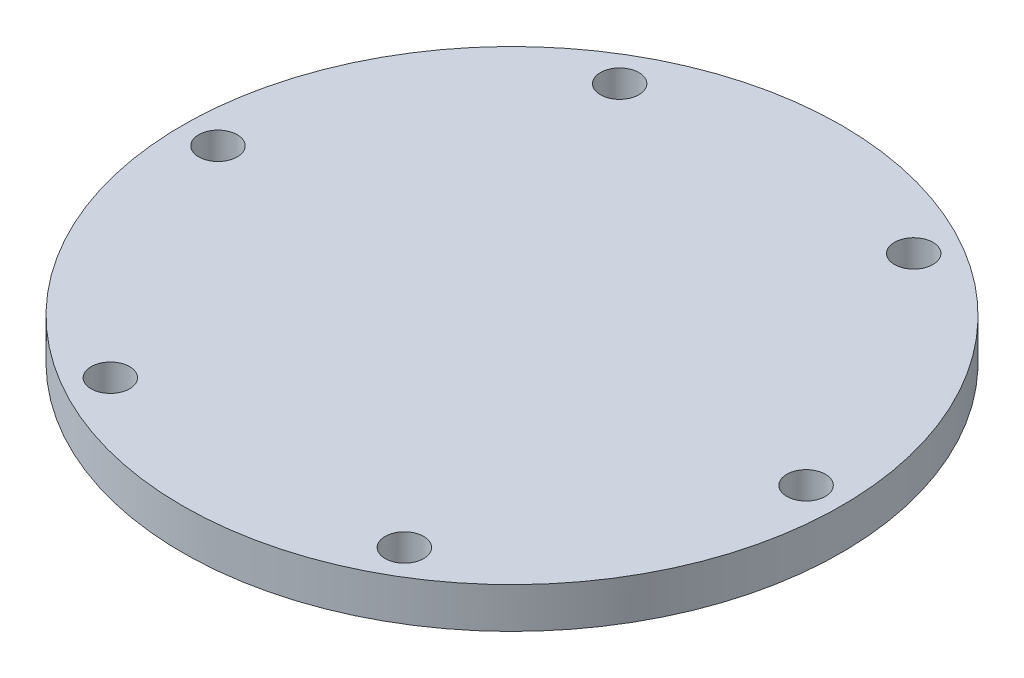
ISO-10303-21;
HEADER;
FILE_DESCRIPTION(('STEP AP214'),'2;1');
FILE_NAME('part.step','',(''),(''),'','','');
FILE_SCHEMA(('AUTOMOTIVE_DESIGN { 1 0 10303 214 1 1 1 1 }'));
ENDSEC;
DATA;
#1=APPLICATION_CONTEXT('core data for automotive mechanical design processes');
#2=APPLICATION_PROTOCOL_DEFINITION('international standard','automotive_design',2000,#1);
#3=PRODUCT_CONTEXT('',#1,'mechanical');
#4=PRODUCT('Part','Part','',(#3));
#5=PRODUCT_RELATED_PRODUCT_CATEGORY('part','',(#4));
#6=PRODUCT_DEFINITION_FORMATION('','',#4);
#7=PRODUCT_DEFINITION_CONTEXT('part definition',#1,'design');
#8=PRODUCT_DEFINITION('design','',#6,#7);
#9=PRODUCT_DEFINITION_SHAPE('','',#8);
#10=(LENGTH_UNIT() NAMED_UNIT(*) SI_UNIT(.MILLI.,.METRE.));
#11=(NAMED_UNIT(*) PLANE_ANGLE_UNIT() SI_UNIT($,.RADIAN.));
#12=(NAMED_UNIT(*) SI_UNIT($,.STERADIAN.) SOLID_ANGLE_UNIT());
#13=UNCERTAINTY_MEASURE_WITH_UNIT(LENGTH_MEASURE(1.E-05),#10,'distance_accuracy_value','');
#14=(GEOMETRIC_REPRESENTATION_CONTEXT(3) GLOBAL_UNCERTAINTY_ASSIGNED_CONTEXT((#13)) GLOBAL_UNIT_ASSIGNED_CONTEXT((#10,
#11,#12)) REPRESENTATION_CONTEXT('',''));
#15=CARTESIAN_POINT('',(0.,0.,0.));
#16=DIRECTION('',(0.,0.,1.));
#17=DIRECTION('',(1.,0.,0.));
#18=AXIS2_PLACEMENT_3D('',#15,#16,#17);
#19=CARTESIAN_POINT('',(0.,7.62,0.));
#20=DIRECTION('',(0.,-1.,0.));
#21=DIRECTION('',(0.,0.,-1.));
#22=AXIS2_PLACEMENT_3D('',#19,#20,#21);
#23=CYLINDRICAL_SURFACE('',#22,13.97);
#24=CARTESIAN_POINT('',(0.,7.62,0.));
#25=DIRECTION('',(0.,-1.,0.));
#26=DIRECTION('',(0.,0.,-1.));
#27=AXIS2_PLACEMENT_3D('',#24,#25,#26);
#28=CIRCLE('',#27,13.97);
#29=CARTESIAN_POINT('',(0.,7.62,-13.97));
#30=VERTEX_POINT('',#29);
#31=EDGE_CURVE('E123',#30,#30,#28,.T.);
#32=CARTESIAN_POINT('',(0.,6.35,0.));
#33=DIRECTION('',(0.,1.,0.));
#34=DIRECTION('',(0.,0.,1.));
#35=AXIS2_PLACEMENT_3D('',#32,#33,#34);
#36=CIRCLE('',#35,13.97);
#37=CARTESIAN_POINT('',(0.,6.35,-13.97));
#38=VERTEX_POINT('',#37);
#39=EDGE_CURVE('E137',#38,#38,#36,.T.);
#40=CARTESIAN_POINT('',(0.,7.62,-13.97));
#41=CARTESIAN_POINT('',(0.,7.60677083333333,-13.97));
#42=CARTESIAN_POINT('',(0.,7.59354166666667,-13.97));
#43=CARTESIAN_POINT('',(0.,7.56708333333333,-13.97));
#44=CARTESIAN_POINT('',(0.,7.55385416666667,-13.97));
#45=CARTESIAN_POINT('',(0.,7.52739583333333,-13.97));
#46=CARTESIAN_POINT('',(0.,7.51416666666667,-13.97));
#47=CARTESIAN_POINT('',(0.,7.48770833333333,-13.97));
#48=CARTESIAN_POINT('',(0.,7.47447916666667,-13.97));
#49=CARTESIAN_POINT('',(0.,7.44802083333333,-13.97));
#50=CARTESIAN_POINT('',(0.,7.43479166666667,-13.97));
#51=CARTESIAN_POINT('',(0.,7.40833333333333,-13.97));
#52=CARTESIAN_POINT('',(0.,7.39510416666667,-13.97));
#53=CARTESIAN_POINT('',(0.,7.36864583333333,-13.97));
#54=CARTESIAN_POINT('',(0.,7.35541666666667,-13.97));
#55=CARTESIAN_POINT('',(0.,7.32895833333333,-13.97));
#56=CARTESIAN_POINT('',(0.,7.31572916666667,-13.97));
#57=CARTESIAN_POINT('',(0.,7.28927083333333,-13.97));
#58=CARTESIAN_POINT('',(0.,7.27604166666667,-13.97));
#59=CARTESIAN_POINT('',(0.,7.24958333333333,-13.97));
#60=CARTESIAN_POINT('',(0.,7.23635416666666,-13.97));
#61=CARTESIAN_POINT('',(0.,7.20989583333333,-13.97));
#62=CARTESIAN_POINT('',(0.,7.19666666666667,-13.97));
#63=CARTESIAN_POINT('',(0.,7.17020833333333,-13.97));
#64=CARTESIAN_POINT('',(0.,7.15697916666667,-13.97));
#65=CARTESIAN_POINT('',(0.,7.13052083333333,-13.97));
#66=CARTESIAN_POINT('',(0.,7.11729166666666,-13.97));
#67=CARTESIAN_POINT('',(0.,7.09083333333333,-13.97));
#68=CARTESIAN_POINT('',(0.,7.07760416666667,-13.97));
#69=CARTESIAN_POINT('',(0.,7.05114583333333,-13.97));
#70=CARTESIAN_POINT('',(0.,7.03791666666667,-13.97));
#71=CARTESIAN_POINT('',(0.,7.01145833333333,-13.97));
#72=CARTESIAN_POINT('',(0.,6.99822916666666,-13.97));
#73=CARTESIAN_POINT('',(0.,6.97177083333333,-13.97));
#74=CARTESIAN_POINT('',(0.,6.95854166666667,-13.97));
#75=CARTESIAN_POINT('',(0.,6.93208333333333,-13.97));
#76=CARTESIAN_POINT('',(0.,6.91885416666666,-13.97));
#77=CARTESIAN_POINT('',(0.,6.89239583333333,-13.97));
#78=CARTESIAN_POINT('',(0.,6.87916666666666,-13.97));
#79=CARTESIAN_POINT('',(0.,6.85270833333333,-13.97));
#80=CARTESIAN_POINT('',(0.,6.83947916666666,-13.97));
#81=CARTESIAN_POINT('',(0.,6.81302083333333,-13.97));
#82=CARTESIAN_POINT('',(0.,6.79979166666666,-13.97));
#83=CARTESIAN_POINT('',(0.,6.77333333333333,-13.97));
#84=CARTESIAN_POINT('',(0.,6.76010416666666,-13.97));
#85=CARTESIAN_POINT('',(0.,6.73364583333333,-13.97));
#86=CARTESIAN_POINT('',(0.,6.72041666666666,-13.97));
#87=CARTESIAN_POINT('',(0.,6.69395833333333,-13.97));
#88=CARTESIAN_POINT('',(0.,6.68072916666666,-13.97));
#89=CARTESIAN_POINT('',(0.,6.65427083333333,-13.97));
#90=CARTESIAN_POINT('',(0.,6.64104166666666,-13.97));
#91=CARTESIAN_POINT('',(0.,6.61458333333333,-13.97));
#92=CARTESIAN_POINT('',(0.,6.60135416666666,-13.97));
#93=CARTESIAN_POINT('',(0.,6.57489583333333,-13.97));
#94=CARTESIAN_POINT('',(0.,6.56166666666666,-13.97));
#95=CARTESIAN_POINT('',(0.,6.53520833333333,-13.97));
#96=CARTESIAN_POINT('',(0.,6.52197916666666,-13.97));
#97=CARTESIAN_POINT('',(0.,6.49552083333333,-13.97));
#98=CARTESIAN_POINT('',(0.,6.48229166666666,-13.97));
#99=CARTESIAN_POINT('',(0.,6.45583333333333,-13.97));
#100=CARTESIAN_POINT('',(0.,6.44260416666666,-13.97));
#101=CARTESIAN_POINT('',(0.,6.41614583333333,-13.97));
#102=CARTESIAN_POINT('',(0.,6.40291666666666,-13.97));
#103=CARTESIAN_POINT('',(0.,6.37645833333333,-13.97));
#104=CARTESIAN_POINT('',(0.,6.36322916666666,-13.97));
#105=CARTESIAN_POINT('',(0.,6.35,-13.97));
#106=B_SPLINE_CURVE_WITH_KNOTS('',3,(#40,#41,#42,#43,#44,#45,#46,#47,#48,#49,#50,#51,#52,#53,
#54,#55,#56,#57,#58,#59,#60,#61,#62,#63,#64,#65,#66,#67,#68,#69,#70,#71,#72,#73,#74,#75,#76,#77,
#78,#79,#80,#81,#82,#83,#84,#85,#86,#87,#88,#89,#90,#91,#92,#93,#94,#95,#96,#97,#98,#99,#100,
#101,#102,#103,#104,#105),.UNSPECIFIED.,.F.,.F.,(4,2,2,2,2,2,2,2,2,2,2,2,2,2,2,2,2,2,2,2,2,2,2,
2,2,2,2,2,2,2,2,2,4),(0.,0.0396874999999998,0.0793749999999996,0.119062499999999,0.15875,
0.1984375,0.238125,0.2778125,0.3175,0.3571875,0.396875000000001,0.4365625,0.47625,
0.515937500000001,0.555625000000001,0.5953125,0.635000000000001,0.674687500000001,
0.714375000000001,0.754062500000001,0.793750000000001,0.833437500000001,0.873125000000001,
0.912812500000001,0.952500000000001,0.992187500000001,1.031875,1.0715625,1.11125,1.1509375,
1.190625,1.2303125,1.27),.UNSPECIFIED.);
#107=EDGE_CURVE('BSEAM50',#30,#38,#106,.T.);
#108=ORIENTED_EDGE('',*,*,#31,.T.);
#109=ORIENTED_EDGE('',*,*,#39,.T.);
#110=ORIENTED_EDGE('',*,*,#107,.T.);
#111=ORIENTED_EDGE('',*,*,#107,.F.);
#112=EDGE_LOOP('',(#108,#110,#109,#111));
#113=FACE_BOUND('',#112,.T.);
#114=ADVANCED_FACE('F50',(#113),#23,.T.);
#115=CARTESIAN_POINT('',(0.,12.7,0.));
#116=DIRECTION('',(0.,-1.,0.));
#117=DIRECTION('',(0.,0.,-1.));
#118=AXIS2_PLACEMENT_3D('',#115,#116,#117);
#119=CYLINDRICAL_SURFACE('',#118,32.385);
#120=CARTESIAN_POINT('',(0.,7.62,0.));
#121=DIRECTION('',(0.,-1.,0.));
#122=DIRECTION('',(0.,0.,-1.));
#123=AXIS2_PLACEMENT_3D('',#120,#121,#122);
#124=CIRCLE('',#123,32.385);
#125=CARTESIAN_POINT('',(0.,7.62,-32.385));
#126=VERTEX_POINT('',#125);
#127=EDGE_CURVE('E118',#126,#126,#124,.T.);
#128=ORIENTED_EDGE('',*,*,#127,.F.);
#129=EDGE_LOOP('',(#128));
#130=FACE_BOUND('',#129,.T.);
#131=CARTESIAN_POINT('',(0.,8.89,0.));
#132=DIRECTION('',(0.,1.,0.));
#133=DIRECTION('',(0.,0.,1.));
#134=AXIS2_PLACEMENT_3D('',#131,#132,#133);
#135=CIRCLE('',#134,32.385);
#136=CARTESIAN_POINT('',(0.,8.89,32.385));
#137=VERTEX_POINT('',#136);
#138=EDGE_CURVE('E125',#137,#137,#135,.T.);
#139=ORIENTED_EDGE('',*,*,#138,.F.);
#140=EDGE_LOOP('',(#139));
#141=FACE_BOUND('',#140,.T.);
#142=ADVANCED_FACE('F77',(#130,#141),#119,.T.);
#143=CARTESIAN_POINT('',(0.,7.62,0.));
#144=DIRECTION('',(0.,-1.,0.));
#145=DIRECTION('',(0.,0.,-1.));
#146=AXIS2_PLACEMENT_3D('',#143,#144,#145);
#147=PLANE('',#146);
#148=ORIENTED_EDGE('',*,*,#31,.F.);
#149=EDGE_LOOP('',(#148));
#150=FACE_BOUND('',#149,.T.);
#151=ORIENTED_EDGE('',*,*,#127,.T.);
#152=EDGE_LOOP('',(#151));
#153=FACE_BOUND('',#152,.T.);
#154=ADVANCED_FACE('F82',(#150,#153),#147,.T.);
#155=CARTESIAN_POINT('',(32.385,8.89,0.));
#156=DIRECTION('',(0.,1.,0.));
#157=DIRECTION('',(0.,0.,1.));
#158=AXIS2_PLACEMENT_3D('',#155,#156,#157);
#159=PLANE('',#158);
#160=ORIENTED_EDGE('',*,*,#138,.T.);
#161=EDGE_LOOP('',(#160));
#162=FACE_BOUND('',#161,.T.);
#163=CARTESIAN_POINT('',(0.,8.89,0.));
#164=DIRECTION('',(0.,1.,0.));
#165=DIRECTION('',(0.,0.,1.));
#166=AXIS2_PLACEMENT_3D('',#163,#164,#165);
#167=CIRCLE('',#166,30.099);
#168=CARTESIAN_POINT('',(0.,8.89,30.099));
#169=VERTEX_POINT('',#168);
#170=EDGE_CURVE('E128',#169,#169,#167,.T.);
#171=ORIENTED_EDGE('',*,*,#170,.F.);
#172=EDGE_LOOP('',(#171));
#173=FACE_BOUND('',#172,.T.);
#174=ADVANCED_FACE('F90',(#162,#173),#159,.T.);
#175=CARTESIAN_POINT('',(0.,18.669,0.));
#176=DIRECTION('',(0.,1.,0.));
#177=DIRECTION('',(0.,0.,1.));
#178=AXIS2_PLACEMENT_3D('',#175,#176,#177);
#179=CYLINDRICAL_SURFACE('',#178,30.099);
#180=ORIENTED_EDGE('',*,*,#170,.T.);
#181=EDGE_LOOP('',(#180));
#182=FACE_BOUND('',#181,.T.);
#183=CARTESIAN_POINT('',(0.,11.43,0.));
#184=DIRECTION('',(0.,1.,0.));
#185=DIRECTION('',(0.,0.,1.));
#186=AXIS2_PLACEMENT_3D('',#183,#184,#185);
#187=CIRCLE('',#186,30.099);
#188=CARTESIAN_POINT('',(0.,11.43,30.099));
#189=VERTEX_POINT('',#188);
#190=EDGE_CURVE('E131',#189,#189,#187,.T.);
#191=ORIENTED_EDGE('',*,*,#190,.F.);
#192=EDGE_LOOP('',(#191));
#193=FACE_BOUND('',#192,.T.);
#194=ADVANCED_FACE('F221',(#182,#193),#179,.T.);
#195=CARTESIAN_POINT('',(30.099,11.43,0.));
#196=DIRECTION('',(0.,-1.,0.));
#197=DIRECTION('',(0.,0.,-1.));
#198=AXIS2_PLACEMENT_3D('',#195,#196,#197);
#199=PLANE('',#198);
#200=ORIENTED_EDGE('',*,*,#190,.T.);
#201=EDGE_LOOP('',(#200));
#202=FACE_BOUND('',#201,.T.);
#203=CARTESIAN_POINT('',(0.,11.43,0.));
#204=DIRECTION('',(0.,1.,0.));
#205=DIRECTION('',(0.,0.,1.));
#206=AXIS2_PLACEMENT_3D('',#203,#204,#205);
#207=CIRCLE('',#206,32.385);
#208=CARTESIAN_POINT('',(0.,11.43,32.385));
#209=VERTEX_POINT('',#208);
#210=EDGE_CURVE('E134',#209,#209,#207,.T.);
#211=ORIENTED_EDGE('',*,*,#210,.F.);
#212=EDGE_LOOP('',(#211));
#213=FACE_BOUND('',#212,.T.);
#214=ADVANCED_FACE('F102',(#202,#213),#199,.T.);
#215=CARTESIAN_POINT('',(0.,17.78,0.));
#216=DIRECTION('',(0.,1.,0.));
#217=DIRECTION('',(0.,0.,1.));
#218=AXIS2_PLACEMENT_3D('',#215,#216,#217);
#219=PLANE('',#218);
#220=CARTESIAN_POINT('',(-18.4150000000004,17.78,31.8957156213807));
#221=DIRECTION('',(0.,1.,0.));
#222=DIRECTION('',(0.866025403784433,0.,0.50000000000001));
#223=AXIS2_PLACEMENT_3D('',#220,#221,#222);
#224=CIRCLE('',#223,2.413);
#225=CARTESIAN_POINT('',(-16.3252807006685,17.78,33.1022156213807));
#226=VERTEX_POINT('',#225);
#227=EDGE_CURVE('E165',#226,#226,#224,.T.);
#228=ORIENTED_EDGE('',*,*,#227,.F.);
#229=EDGE_LOOP('',(#228));
#230=FACE_BOUND('',#229,.T.);
#231=CARTESIAN_POINT('',(18.4149999999997,17.78,31.895715621381));
#232=DIRECTION('',(0.,1.,0.));
#233=DIRECTION('',(0.866025403784443,0.,-0.499999999999992));
#234=AXIS2_PLACEMENT_3D('',#231,#232,#233);
#235=CIRCLE('',#234,2.413);
#236=CARTESIAN_POINT('',(20.5047192993316,17.78,30.6892156213811));
#237=VERTEX_POINT('',#236);
#238=EDGE_CURVE('E171',#237,#237,#235,.T.);
#239=ORIENTED_EDGE('',*,*,#238,.F.);
#240=EDGE_LOOP('',(#239));
#241=FACE_BOUND('',#240,.T.);
#242=CARTESIAN_POINT('',(36.83,17.78,0.));
#243=DIRECTION('',(0.,1.,0.));
#244=DIRECTION('',(0.,0.,-1.));
#245=AXIS2_PLACEMENT_3D('',#242,#243,#244);
#246=CIRCLE('',#245,2.413);
#247=CARTESIAN_POINT('',(36.83,17.78,-2.413));
#248=VERTEX_POINT('',#247);
#249=EDGE_CURVE('E177',#248,#248,#246,.T.);
#250=ORIENTED_EDGE('',*,*,#249,.F.);
#251=EDGE_LOOP('',(#250));
#252=FACE_BOUND('',#251,.T.);
#253=CARTESIAN_POINT('',(18.4150000000001,17.78,-31.8957156213808));
#254=DIRECTION('',(0.,1.,0.));
#255=DIRECTION('',(-0.866025403784436,0.,-0.500000000000004));
#256=AXIS2_PLACEMENT_3D('',#253,#254,#255);
#257=CIRCLE('',#256,2.413);
#258=CARTESIAN_POINT('',(16.3252807006683,17.78,-33.1022156213808));
#259=VERTEX_POINT('',#258);
#260=EDGE_CURVE('E159',#259,#259,#257,.T.);
#261=ORIENTED_EDGE('',*,*,#260,.F.);
#262=EDGE_LOOP('',(#261));
#263=FACE_BOUND('',#262,.T.);
#264=CARTESIAN_POINT('',(-18.4149999999999,17.78,-31.8957156213809));
#265=DIRECTION('',(0.,1.,0.));
#266=DIRECTION('',(-0.86602540378444,0.,0.499999999999998));
#267=AXIS2_PLACEMENT_3D('',#264,#265,#266);
#268=CIRCLE('',#267,2.413);
#269=CARTESIAN_POINT('',(-20.5047192993318,17.78,-30.6892156213809));
#270=VERTEX_POINT('',#269);
#271=EDGE_CURVE('E153',#270,#270,#268,.T.);
#272=ORIENTED_EDGE('',*,*,#271,.F.);
#273=EDGE_LOOP('',(#272));
#274=FACE_BOUND('',#273,.T.);
#275=CARTESIAN_POINT('',(-36.83,17.78,0.));
#276=DIRECTION('',(0.,1.,0.));
#277=DIRECTION('',(0.,0.,1.));
#278=AXIS2_PLACEMENT_3D('',#275,#276,#277);
#279=CIRCLE('',#278,2.413);
#280=CARTESIAN_POINT('',(-36.83,17.78,2.413));
#281=VERTEX_POINT('',#280);
#282=EDGE_CURVE('E149',#281,#281,#279,.T.);
#283=ORIENTED_EDGE('',*,*,#282,.F.);
#284=EDGE_LOOP('',(#283));
#285=FACE_BOUND('',#284,.T.);
#286=CARTESIAN_POINT('',(0.,17.78,0.));
#287=DIRECTION('',(0.,1.,0.));
#288=DIRECTION('',(0.,0.,1.));
#289=AXIS2_PLACEMENT_3D('',#286,#287,#288);
#290=CIRCLE('',#289,41.275);
#291=CARTESIAN_POINT('',(0.,17.78,41.275));
#292=VERTEX_POINT('',#291);
#293=EDGE_CURVE('E58',#292,#292,#290,.T.);
#294=ORIENTED_EDGE('',*,*,#293,.T.);
#295=EDGE_LOOP('',(#294));
#296=FACE_BOUND('',#295,.T.);
#297=ADVANCED_FACE('F100',(#230,#241,#252,#263,#274,#285,#296),#219,.T.);
#298=CARTESIAN_POINT('',(0.,17.78,0.));
#299=DIRECTION('',(0.,-1.,0.));
#300=DIRECTION('',(0.,0.,-1.));
#301=AXIS2_PLACEMENT_3D('',#298,#299,#300);
#302=CYLINDRICAL_SURFACE('',#301,41.275);
#303=ORIENTED_EDGE('',*,*,#293,.F.);
#304=EDGE_LOOP('',(#303));
#305=FACE_BOUND('',#304,.T.);
#306=CARTESIAN_POINT('',(0.,12.7,0.));
#307=DIRECTION('',(0.,-1.,0.));
#308=DIRECTION('',(0.,0.,-1.));
#309=AXIS2_PLACEMENT_3D('',#306,#307,#308);
#310=CIRCLE('',#309,41.275);
#311=CARTESIAN_POINT('',(0.,12.7,-41.275));
#312=VERTEX_POINT('',#311);
#313=EDGE_CURVE('E113',#312,#312,#310,.T.);
#314=ORIENTED_EDGE('',*,*,#313,.F.);
#315=EDGE_LOOP('',(#314));
#316=FACE_BOUND('',#315,.T.);
#317=ADVANCED_FACE('F98',(#305,#316),#302,.T.);
#318=CARTESIAN_POINT('',(0.,12.7,0.));
#319=DIRECTION('',(0.,-1.,0.));
#320=DIRECTION('',(0.,0.,-1.));
#321=AXIS2_PLACEMENT_3D('',#318,#319,#320);
#322=PLANE('',#321);
#323=CARTESIAN_POINT('',(-18.4150000000004,12.7,31.8957156213807));
#324=DIRECTION('',(0.,-1.,0.));
#325=DIRECTION('',(0.,0.,-1.));
#326=AXIS2_PLACEMENT_3D('',#323,#324,#325);
#327=CIRCLE('',#326,2.413);
#328=CARTESIAN_POINT('',(-18.4150000000004,12.7,29.4827156213807));
#329=VERTEX_POINT('',#328);
#330=EDGE_CURVE('E162',#329,#329,#327,.F.);
#331=ORIENTED_EDGE('',*,*,#330,.T.);
#332=EDGE_LOOP('',(#331));
#333=FACE_BOUND('',#332,.T.);
#334=CARTESIAN_POINT('',(18.4149999999997,12.7,31.895715621381));
#335=DIRECTION('',(0.,-1.,0.));
#336=DIRECTION('',(0.,0.,-1.));
#337=AXIS2_PLACEMENT_3D('',#334,#335,#336);
#338=CIRCLE('',#337,2.413);
#339=CARTESIAN_POINT('',(18.4149999999997,12.7,29.482715621381));
#340=VERTEX_POINT('',#339);
#341=EDGE_CURVE('E168',#340,#340,#338,.F.);
#342=ORIENTED_EDGE('',*,*,#341,.T.);
#343=EDGE_LOOP('',(#342));
#344=FACE_BOUND('',#343,.T.);
#345=CARTESIAN_POINT('',(36.83,12.7,0.));
#346=DIRECTION('',(0.,-1.,0.));
#347=DIRECTION('',(0.,0.,-1.));
#348=AXIS2_PLACEMENT_3D('',#345,#346,#347);
#349=CIRCLE('',#348,2.413);
#350=CARTESIAN_POINT('',(36.83,12.7,-2.413));
#351=VERTEX_POINT('',#350);
#352=EDGE_CURVE('E174',#351,#351,#349,.F.);
#353=ORIENTED_EDGE('',*,*,#352,.T.);
#354=EDGE_LOOP('',(#353));
#355=FACE_BOUND('',#354,.T.);
#356=CARTESIAN_POINT('',(18.4150000000001,12.7,-31.8957156213808));
#357=DIRECTION('',(0.,-1.,0.));
#358=DIRECTION('',(0.,0.,-1.));
#359=AXIS2_PLACEMENT_3D('',#356,#357,#358);
#360=CIRCLE('',#359,2.413);
#361=CARTESIAN_POINT('',(18.4150000000001,12.7,-34.3087156213808));
#362=VERTEX_POINT('',#361);
#363=EDGE_CURVE('E180',#362,#362,#360,.F.);
#364=ORIENTED_EDGE('',*,*,#363,.T.);
#365=EDGE_LOOP('',(#364));
#366=FACE_BOUND('',#365,.T.);
#367=CARTESIAN_POINT('',(-18.4149999999999,12.7,-31.8957156213809));
#368=DIRECTION('',(0.,-1.,0.));
#369=DIRECTION('',(0.,0.,-1.));
#370=AXIS2_PLACEMENT_3D('',#367,#368,#369);
#371=CIRCLE('',#370,2.413);
#372=CARTESIAN_POINT('',(-18.4149999999999,12.7,-34.3087156213809));
#373=VERTEX_POINT('',#372);
#374=EDGE_CURVE('E156',#373,#373,#371,.F.);
#375=ORIENTED_EDGE('',*,*,#374,.T.);
#376=EDGE_LOOP('',(#375));
#377=FACE_BOUND('',#376,.T.);
#378=CARTESIAN_POINT('',(-36.83,12.7,0.));
#379=DIRECTION('',(0.,-1.,0.));
#380=DIRECTION('',(0.,0.,-1.));
#381=AXIS2_PLACEMENT_3D('',#378,#379,#380);
#382=CIRCLE('',#381,2.413);
#383=CARTESIAN_POINT('',(-36.83,12.7,-2.413));
#384=VERTEX_POINT('',#383);
#385=EDGE_CURVE('E150',#384,#384,#382,.F.);
#386=ORIENTED_EDGE('',*,*,#385,.T.);
#387=EDGE_LOOP('',(#386));
#388=FACE_BOUND('',#387,.T.);
#389=CARTESIAN_POINT('',(0.,12.7,0.));
#390=DIRECTION('',(0.,-1.,0.));
#391=DIRECTION('',(0.,0.,-1.));
#392=AXIS2_PLACEMENT_3D('',#389,#390,#391);
#393=CIRCLE('',#392,32.385);
#394=CARTESIAN_POINT('',(0.,12.7,-32.385));
#395=VERTEX_POINT('',#394);
#396=EDGE_CURVE('E115',#395,#395,#393,.T.);
#397=ORIENTED_EDGE('',*,*,#396,.F.);
#398=EDGE_LOOP('',(#397));
#399=FACE_BOUND('',#398,.T.);
#400=ORIENTED_EDGE('',*,*,#313,.T.);
#401=EDGE_LOOP('',(#400));
#402=FACE_BOUND('',#401,.T.);
#403=ADVANCED_FACE('F95',(#333,#344,#355,#366,#377,#388,#399,#402),#322,.T.);
#404=ORIENTED_EDGE('',*,*,#396,.T.);
#405=EDGE_LOOP('',(#404));
#406=FACE_BOUND('',#405,.T.);
#407=ORIENTED_EDGE('',*,*,#210,.T.);
#408=EDGE_LOOP('',(#407));
#409=FACE_BOUND('',#408,.T.);
#410=ADVANCED_FACE('F85',(#406,#409),#119,.T.);
#411=CARTESIAN_POINT('',(13.97,6.35,0.));
#412=DIRECTION('',(0.,-1.,0.));
#413=DIRECTION('',(0.,0.,-1.));
#414=AXIS2_PLACEMENT_3D('',#411,#412,#413);
#415=PLANE('',#414);
#416=CARTESIAN_POINT('',(0.,6.35,0.));
#417=DIRECTION('',(0.,1.,0.));
#418=DIRECTION('',(0.,0.,1.));
#419=AXIS2_PLACEMENT_3D('',#416,#417,#418);
#420=CIRCLE('',#419,11.684);
#421=CARTESIAN_POINT('',(0.,6.35,11.684));
#422=VERTEX_POINT('',#421);
#423=EDGE_CURVE('E140',#422,#422,#420,.T.);
#424=ORIENTED_EDGE('',*,*,#423,.T.);
#425=EDGE_LOOP('',(#424));
#426=FACE_BOUND('',#425,.T.);
#427=ORIENTED_EDGE('',*,*,#39,.F.);
#428=EDGE_LOOP('',(#427));
#429=FACE_BOUND('',#428,.T.);
#430=ADVANCED_FACE('F215',(#426,#429),#415,.T.);
#431=CARTESIAN_POINT('',(0.,18.669,0.));
#432=DIRECTION('',(0.,1.,0.));
#433=DIRECTION('',(0.,0.,1.));
#434=AXIS2_PLACEMENT_3D('',#431,#432,#433);
#435=CYLINDRICAL_SURFACE('',#434,11.684);
#436=CARTESIAN_POINT('',(0.,3.81,0.));
#437=DIRECTION('',(0.,1.,0.));
#438=DIRECTION('',(0.,0.,1.));
#439=AXIS2_PLACEMENT_3D('',#436,#437,#438);
#440=CIRCLE('',#439,11.684);
#441=CARTESIAN_POINT('',(0.,3.81,11.684));
#442=VERTEX_POINT('',#441);
#443=EDGE_CURVE('E143',#442,#442,#440,.T.);
#444=ORIENTED_EDGE('',*,*,#443,.T.);
#445=EDGE_LOOP('',(#444));
#446=FACE_BOUND('',#445,.T.);
#447=ORIENTED_EDGE('',*,*,#423,.F.);
#448=EDGE_LOOP('',(#447));
#449=FACE_BOUND('',#448,.T.);
#450=ADVANCED_FACE('F211',(#446,#449),#435,.T.);
#451=CARTESIAN_POINT('',(11.684,3.81,0.));
#452=DIRECTION('',(0.,1.,0.));
#453=DIRECTION('',(0.,0.,1.));
#454=AXIS2_PLACEMENT_3D('',#451,#452,#453);
#455=PLANE('',#454);
#456=CARTESIAN_POINT('',(0.,3.81,0.));
#457=DIRECTION('',(0.,1.,0.));
#458=DIRECTION('',(0.,0.,1.));
#459=AXIS2_PLACEMENT_3D('',#456,#457,#458);
#460=CIRCLE('',#459,13.97);
#461=CARTESIAN_POINT('',(0.,3.81,-13.97));
#462=VERTEX_POINT('',#461);
#463=EDGE_CURVE('E146',#462,#462,#460,.T.);
#464=ORIENTED_EDGE('',*,*,#463,.T.);
#465=EDGE_LOOP('',(#464));
#466=FACE_BOUND('',#465,.T.);
#467=ORIENTED_EDGE('',*,*,#443,.F.);
#468=EDGE_LOOP('',(#467));
#469=FACE_BOUND('',#468,.T.);
#470=ADVANCED_FACE('F72',(#466,#469),#455,.T.);
#471=CARTESIAN_POINT('',(0.,2.54,0.));
#472=DIRECTION('',(0.,1.,0.));
#473=DIRECTION('',(0.,0.,1.));
#474=AXIS2_PLACEMENT_3D('',#471,#472,#473);
#475=CIRCLE('',#474,13.97);
#476=CARTESIAN_POINT('',(0.,2.54,-13.97));
#477=VERTEX_POINT('',#476);
#478=EDGE_CURVE('E13',#477,#477,#475,.T.);
#479=CARTESIAN_POINT('',(0.,2.54,-13.97));
#480=CARTESIAN_POINT('',(0.,2.55322916666667,-13.97));
#481=CARTESIAN_POINT('',(0.,2.56645833333333,-13.97));
#482=CARTESIAN_POINT('',(0.,2.59291666666667,-13.97));
#483=CARTESIAN_POINT('',(0.,2.60614583333333,-13.97));
#484=CARTESIAN_POINT('',(0.,2.63260416666667,-13.97));
#485=CARTESIAN_POINT('',(0.,2.64583333333333,-13.97));
#486=CARTESIAN_POINT('',(0.,2.67229166666667,-13.97));
#487=CARTESIAN_POINT('',(0.,2.68552083333333,-13.97));
#488=CARTESIAN_POINT('',(0.,2.71197916666667,-13.97));
#489=CARTESIAN_POINT('',(0.,2.72520833333333,-13.97));
#490=CARTESIAN_POINT('',(0.,2.75166666666667,-13.97));
#491=CARTESIAN_POINT('',(0.,2.76489583333333,-13.97));
#492=CARTESIAN_POINT('',(0.,2.79135416666667,-13.97));
#493=CARTESIAN_POINT('',(0.,2.80458333333333,-13.97));
#494=CARTESIAN_POINT('',(0.,2.83104166666667,-13.97));
#495=CARTESIAN_POINT('',(0.,2.84427083333333,-13.97));
#496=CARTESIAN_POINT('',(0.,2.87072916666667,-13.97));
#497=CARTESIAN_POINT('',(0.,2.88395833333333,-13.97));
#498=CARTESIAN_POINT('',(0.,2.91041666666667,-13.97));
#499=CARTESIAN_POINT('',(0.,2.92364583333333,-13.97));
#500=CARTESIAN_POINT('',(0.,2.95010416666667,-13.97));
#501=CARTESIAN_POINT('',(0.,2.96333333333333,-13.97));
#502=CARTESIAN_POINT('',(0.,2.98979166666667,-13.97));
#503=CARTESIAN_POINT('',(0.,3.00302083333333,-13.97));
#504=CARTESIAN_POINT('',(0.,3.02947916666667,-13.97));
#505=CARTESIAN_POINT('',(0.,3.04270833333333,-13.97));
#506=CARTESIAN_POINT('',(0.,3.06916666666667,-13.97));
#507=CARTESIAN_POINT('',(0.,3.08239583333333,-13.97));
#508=CARTESIAN_POINT('',(0.,3.10885416666667,-13.97));
#509=CARTESIAN_POINT('',(0.,3.12208333333333,-13.97));
#510=CARTESIAN_POINT('',(0.,3.14854166666667,-13.97));
#511=CARTESIAN_POINT('',(0.,3.16177083333333,-13.97));
#512=CARTESIAN_POINT('',(0.,3.18822916666667,-13.97));
#513=CARTESIAN_POINT('',(0.,3.20145833333333,-13.97));
#514=CARTESIAN_POINT('',(0.,3.22791666666667,-13.97));
#515=CARTESIAN_POINT('',(0.,3.24114583333333,-13.97));
#516=CARTESIAN_POINT('',(0.,3.26760416666667,-13.97));
#517=CARTESIAN_POINT('',(0.,3.28083333333333,-13.97));
#518=CARTESIAN_POINT('',(0.,3.30729166666667,-13.97));
#519=CARTESIAN_POINT('',(0.,3.32052083333333,-13.97));
#520=CARTESIAN_POINT('',(0.,3.34697916666667,-13.97));
#521=CARTESIAN_POINT('',(0.,3.36020833333333,-13.97));
#522=CARTESIAN_POINT('',(0.,3.38666666666667,-13.97));
#523=CARTESIAN_POINT('',(0.,3.39989583333333,-13.97));
#524=CARTESIAN_POINT('',(0.,3.42635416666667,-13.97));
#525=CARTESIAN_POINT('',(0.,3.43958333333333,-13.97));
#526=CARTESIAN_POINT('',(0.,3.46604166666667,-13.97));
#527=CARTESIAN_POINT('',(0.,3.47927083333333,-13.97));
#528=CARTESIAN_POINT('',(0.,3.50572916666667,-13.97));
#529=CARTESIAN_POINT('',(0.,3.51895833333333,-13.97));
#530=CARTESIAN_POINT('',(0.,3.54541666666667,-13.97));
#531=CARTESIAN_POINT('',(0.,3.55864583333333,-13.97));
#532=CARTESIAN_POINT('',(0.,3.58510416666667,-13.97));
#533=CARTESIAN_POINT('',(0.,3.59833333333333,-13.97));
#534=CARTESIAN_POINT('',(0.,3.62479166666667,-13.97));
#535=CARTESIAN_POINT('',(0.,3.63802083333333,-13.97));
#536=CARTESIAN_POINT('',(0.,3.66447916666667,-13.97));
#537=CARTESIAN_POINT('',(0.,3.67770833333333,-13.97));
#538=CARTESIAN_POINT('',(0.,3.70416666666667,-13.97));
#539=CARTESIAN_POINT('',(0.,3.71739583333333,-13.97));
#540=CARTESIAN_POINT('',(0.,3.74385416666667,-13.97));
#541=CARTESIAN_POINT('',(0.,3.75708333333333,-13.97));
#542=CARTESIAN_POINT('',(0.,3.78354166666667,-13.97));
#543=CARTESIAN_POINT('',(0.,3.79677083333333,-13.97));
#544=CARTESIAN_POINT('',(0.,3.81,-13.97));
#545=B_SPLINE_CURVE_WITH_KNOTS('',3,(#479,#480,#481,#482,#483,#484,#485,#486,#487,#488,#489,
#490,#491,#492,#493,#494,#495,#496,#497,#498,#499,#500,#501,#502,#503,#504,#505,#506,#507,#508,
#509,#510,#511,#512,#513,#514,#515,#516,#517,#518,#519,#520,#521,#522,#523,#524,#525,#526,#527,
#528,#529,#530,#531,#532,#533,#534,#535,#536,#537,#538,#539,#540,#541,#542,#543,#544),
.UNSPECIFIED.,.F.,.F.,(4,2,2,2,2,2,2,2,2,2,2,2,2,2,2,2,2,2,2,2,2,2,2,2,2,2,2,2,2,2,2,2,4),(0.,
0.0396874999999998,0.0793750000000004,0.1190625,0.15875,0.198437500000001,0.238125,0.2778125,
0.3175,0.357187500000001,0.396875000000001,0.4365625,0.476250000000001,0.515937500000001,
0.555625000000001,0.595312500000001,0.635000000000001,0.674687500000001,0.714375000000001,
0.754062500000001,0.793750000000001,0.833437500000001,0.873125000000001,0.912812500000001,
0.952500000000002,0.992187500000002,1.031875,1.0715625,1.11125,1.1509375,1.190625,1.2303125,
1.27),.UNSPECIFIED.);
#546=EDGE_CURVE('BSEAM63',#477,#462,#545,.T.);
#547=ORIENTED_EDGE('',*,*,#478,.T.);
#548=ORIENTED_EDGE('',*,*,#463,.F.);
#549=ORIENTED_EDGE('',*,*,#546,.T.);
#550=ORIENTED_EDGE('',*,*,#546,.F.);
#551=EDGE_LOOP('',(#547,#549,#548,#550));
#552=FACE_BOUND('',#551,.T.);
#553=ADVANCED_FACE('F63',(#552),#23,.T.);
#554=CARTESIAN_POINT('',(0.,2.54,0.));
#555=DIRECTION('',(0.,1.,0.));
#556=DIRECTION('',(0.,0.,1.));
#557=AXIS2_PLACEMENT_3D('',#554,#555,#556);
#558=CONICAL_SURFACE('',#557,13.9700000000003,1.39094282700242);
#559=ORIENTED_EDGE('',*,*,#478,.F.);
#560=EDGE_LOOP('',(#559));
#561=FACE_BOUND('',#560,.T.);
#562=CARTESIAN_POINT('',(0.,0.,2.51534904016637E-13));
#563=VERTEX_POINT('',#562);
#564=VERTEX_LOOP('',#563);
#565=FACE_BOUND('',#564,.T.);
#566=ADVANCED_FACE('F53',(#561,#565),#558,.T.);
#567=CARTESIAN_POINT('',(-36.83,-0.001000000000001,0.));
#568=DIRECTION('',(0.,1.,0.));
#569=DIRECTION('',(0.,0.,1.));
#570=AXIS2_PLACEMENT_3D('',#567,#568,#569);
#571=CYLINDRICAL_SURFACE('',#570,2.413);
#572=ORIENTED_EDGE('',*,*,#385,.F.);
#573=EDGE_LOOP('',(#572));
#574=FACE_BOUND('',#573,.T.);
#575=ORIENTED_EDGE('',*,*,#282,.T.);
#576=EDGE_LOOP('',(#575));
#577=FACE_BOUND('',#576,.T.);
#578=ADVANCED_FACE('F62',(#574,#577),#571,.F.);
#579=CARTESIAN_POINT('',(-18.4149999999999,-0.001000000000001,-31.8957156213809));
#580=DIRECTION('',(0.,1.,0.));
#581=DIRECTION('',(0.,0.,1.));
#582=AXIS2_PLACEMENT_3D('',#579,#580,#581);
#583=CYLINDRICAL_SURFACE('',#582,2.413);
#584=ORIENTED_EDGE('',*,*,#374,.F.);
#585=EDGE_LOOP('',(#584));
#586=FACE_BOUND('',#585,.T.);
#587=ORIENTED_EDGE('',*,*,#271,.T.);
#588=EDGE_LOOP('',(#587));
#589=FACE_BOUND('',#588,.T.);
#590=ADVANCED_FACE('F69',(#586,#589),#583,.F.);
#591=CARTESIAN_POINT('',(18.4150000000001,-0.001000000000001,-31.8957156213808));
#592=DIRECTION('',(0.,1.,0.));
#593=DIRECTION('',(0.,0.,1.));
#594=AXIS2_PLACEMENT_3D('',#591,#592,#593);
#595=CYLINDRICAL_SURFACE('',#594,2.413);
#596=ORIENTED_EDGE('',*,*,#363,.F.);
#597=EDGE_LOOP('',(#596));
#598=FACE_BOUND('',#597,.T.);
#599=ORIENTED_EDGE('',*,*,#260,.T.);
#600=EDGE_LOOP('',(#599));
#601=FACE_BOUND('',#600,.T.);
#602=ADVANCED_FACE('F186',(#598,#601),#595,.F.);
#603=CARTESIAN_POINT('',(36.83,-0.001000000000001,0.));
#604=DIRECTION('',(0.,1.,0.));
#605=DIRECTION('',(0.,0.,1.));
#606=AXIS2_PLACEMENT_3D('',#603,#604,#605);
#607=CYLINDRICAL_SURFACE('',#606,2.413);
#608=ORIENTED_EDGE('',*,*,#352,.F.);
#609=EDGE_LOOP('',(#608));
#610=FACE_BOUND('',#609,.T.);
#611=ORIENTED_EDGE('',*,*,#249,.T.);
#612=EDGE_LOOP('',(#611));
#613=FACE_BOUND('',#612,.T.);
#614=ADVANCED_FACE('F201',(#610,#613),#607,.F.);
#615=CARTESIAN_POINT('',(18.4149999999997,-0.001000000000001,31.895715621381));
#616=DIRECTION('',(0.,1.,0.));
#617=DIRECTION('',(0.,0.,1.));
#618=AXIS2_PLACEMENT_3D('',#615,#616,#617);
#619=CYLINDRICAL_SURFACE('',#618,2.413);
#620=ORIENTED_EDGE('',*,*,#341,.F.);
#621=EDGE_LOOP('',(#620));
#622=FACE_BOUND('',#621,.T.);
#623=ORIENTED_EDGE('',*,*,#238,.T.);
#624=EDGE_LOOP('',(#623));
#625=FACE_BOUND('',#624,.T.);
#626=ADVANCED_FACE('F303',(#622,#625),#619,.F.);
#627=CARTESIAN_POINT('',(-18.4150000000004,-0.001000000000001,31.8957156213807));
#628=DIRECTION('',(0.,1.,0.));
#629=DIRECTION('',(0.,0.,1.));
#630=AXIS2_PLACEMENT_3D('',#627,#628,#629);
#631=CYLINDRICAL_SURFACE('',#630,2.413);
#632=ORIENTED_EDGE('',*,*,#330,.F.);
#633=EDGE_LOOP('',(#632));
#634=FACE_BOUND('',#633,.T.);
#635=ORIENTED_EDGE('',*,*,#227,.T.);
#636=EDGE_LOOP('',(#635));
#637=FACE_BOUND('',#636,.T.);
#638=ADVANCED_FACE('F206',(#634,#637),#631,.F.);
#639=CLOSED_SHELL('',(#114,#142,#154,#174,#194,#214,#297,#317,#403,#410,#430,#450,#470,#553,
#566,#578,#590,#602,#614,#626,#638));
#640=MANIFOLD_SOLID_BREP('B2',#639);
#641=ADVANCED_BREP_SHAPE_REPRESENTATION('',(#18,#640),#14);
#642=SHAPE_DEFINITION_REPRESENTATION(#9,#641);
ENDSEC;
END-ISO-10303-21;
